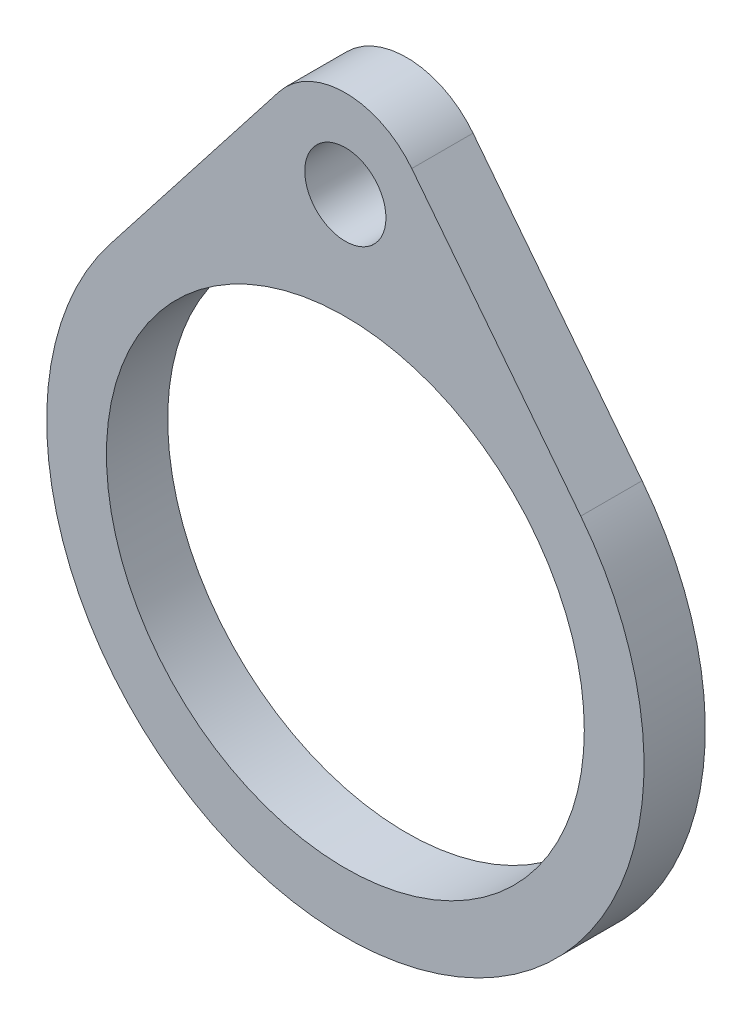
ISO-10303-21;
HEADER;
FILE_DESCRIPTION(('STEP AP214'),'2;1');
FILE_NAME('part.step','',(''),(''),'','','');
FILE_SCHEMA(('AUTOMOTIVE_DESIGN { 1 0 10303 214 1 1 1 1 }'));
ENDSEC;
DATA;
#1=APPLICATION_CONTEXT('core data for automotive mechanical design processes');
#2=APPLICATION_PROTOCOL_DEFINITION('international standard','automotive_design',2000,#1);
#3=PRODUCT_CONTEXT('',#1,'mechanical');
#4=PRODUCT('Part','Part','',(#3));
#5=PRODUCT_RELATED_PRODUCT_CATEGORY('part','',(#4));
#6=PRODUCT_DEFINITION_FORMATION('','',#4);
#7=PRODUCT_DEFINITION_CONTEXT('part definition',#1,'design');
#8=PRODUCT_DEFINITION('design','',#6,#7);
#9=PRODUCT_DEFINITION_SHAPE('','',#8);
#10=(LENGTH_UNIT() NAMED_UNIT(*) SI_UNIT(.MILLI.,.METRE.));
#11=(NAMED_UNIT(*) PLANE_ANGLE_UNIT() SI_UNIT($,.RADIAN.));
#12=(NAMED_UNIT(*) SI_UNIT($,.STERADIAN.) SOLID_ANGLE_UNIT());
#13=UNCERTAINTY_MEASURE_WITH_UNIT(LENGTH_MEASURE(1.E-05),#10,'distance_accuracy_value','');
#14=(GEOMETRIC_REPRESENTATION_CONTEXT(3) GLOBAL_UNCERTAINTY_ASSIGNED_CONTEXT((#13)) GLOBAL_UNIT_ASSIGNED_CONTEXT((#10,
#11,#12)) REPRESENTATION_CONTEXT('',''));
#15=CARTESIAN_POINT('',(0.,0.,0.));
#16=DIRECTION('',(0.,0.,1.));
#17=DIRECTION('',(1.,0.,0.));
#18=AXIS2_PLACEMENT_3D('',#15,#16,#17);
#19=CARTESIAN_POINT('',(0.,0.,4.));
#20=DIRECTION('',(0.,0.,1.));
#21=DIRECTION('',(1.,0.,0.));
#22=AXIS2_PLACEMENT_3D('',#19,#20,#21);
#23=PLANE('',#22);
#24=CARTESIAN_POINT('',(0.,0.,4.));
#25=DIRECTION('',(0.,0.,1.));
#26=DIRECTION('',(1.,0.,0.));
#27=AXIS2_PLACEMENT_3D('',#24,#25,#26);
#28=CIRCLE('',#27,19.5);
#29=CARTESIAN_POINT('',(-15.3704261489394,12.,4.));
#30=VERTEX_POINT('',#29);
#31=CARTESIAN_POINT('',(15.3704261489394,12.,4.));
#32=VERTEX_POINT('',#31);
#33=EDGE_CURVE('E11',#30,#32,#28,.T.);
#34=ORIENTED_EDGE('',*,*,#33,.T.);
#35=DIRECTION('',(-0.615384615384615,0.788226981996893,0.));
#36=VECTOR('',#35,1.);
#37=CARTESIAN_POINT('',(15.3704261489394,12.,4.));
#38=LINE('',#37,#36);
#39=CARTESIAN_POINT('',(4.33524840098291,26.1346153846154,4.));
#40=VERTEX_POINT('',#39);
#41=EDGE_CURVE('E95',#32,#40,#38,.T.);
#42=ORIENTED_EDGE('',*,*,#41,.T.);
#43=CARTESIAN_POINT('',(0.,22.75,4.));
#44=DIRECTION('',(0.,0.,1.));
#45=DIRECTION('',(1.,0.,0.));
#46=AXIS2_PLACEMENT_3D('',#43,#44,#45);
#47=CIRCLE('',#46,5.5);
#48=CARTESIAN_POINT('',(-4.33524840098291,26.1346153846154,4.));
#49=VERTEX_POINT('',#48);
#50=EDGE_CURVE('E83',#40,#49,#47,.T.);
#51=ORIENTED_EDGE('',*,*,#50,.T.);
#52=DIRECTION('',(0.615384615384615,0.788226981996893,0.));
#53=VECTOR('',#52,1.);
#54=CARTESIAN_POINT('',(-15.3704261489394,12.,4.));
#55=LINE('',#54,#53);
#56=EDGE_CURVE('E102',#30,#49,#55,.T.);
#57=ORIENTED_EDGE('',*,*,#56,.F.);
#58=EDGE_LOOP('',(#34,#42,#51,#57));
#59=FACE_BOUND('',#58,.T.);
#60=CARTESIAN_POINT('',(0.,0.,4.));
#61=DIRECTION('',(0.,0.,1.));
#62=DIRECTION('',(1.,0.,0.));
#63=AXIS2_PLACEMENT_3D('',#60,#61,#62);
#64=CIRCLE('',#63,15.6);
#65=CARTESIAN_POINT('',(15.6,0.,4.));
#66=VERTEX_POINT('',#65);
#67=EDGE_CURVE('E119',#66,#66,#64,.T.);
#68=ORIENTED_EDGE('',*,*,#67,.F.);
#69=EDGE_LOOP('',(#68));
#70=FACE_BOUND('',#69,.T.);
#71=CARTESIAN_POINT('',(0.,22.5,4.));
#72=DIRECTION('',(0.,0.,1.));
#73=DIRECTION('',(1.,0.,0.));
#74=AXIS2_PLACEMENT_3D('',#71,#72,#73);
#75=CIRCLE('',#74,2.65);
#76=CARTESIAN_POINT('',(2.65,22.5,4.));
#77=VERTEX_POINT('',#76);
#78=EDGE_CURVE('E164',#77,#77,#75,.T.);
#79=ORIENTED_EDGE('',*,*,#78,.F.);
#80=EDGE_LOOP('',(#79));
#81=FACE_BOUND('',#80,.T.);
#82=ADVANCED_FACE('F45',(#59,#70,#81),#23,.T.);
#83=CARTESIAN_POINT('',(0.,0.,0.));
#84=DIRECTION('',(0.,0.,1.));
#85=DIRECTION('',(1.,0.,0.));
#86=AXIS2_PLACEMENT_3D('',#83,#84,#85);
#87=PLANE('',#86);
#88=CARTESIAN_POINT('',(0.,0.,0.));
#89=DIRECTION('',(0.,0.,1.));
#90=DIRECTION('',(1.,0.,0.));
#91=AXIS2_PLACEMENT_3D('',#88,#89,#90);
#92=CIRCLE('',#91,19.5);
#93=CARTESIAN_POINT('',(-15.3704261489394,12.,0.));
#94=VERTEX_POINT('',#93);
#95=CARTESIAN_POINT('',(15.3704261489394,12.,0.));
#96=VERTEX_POINT('',#95);
#97=EDGE_CURVE('E49',#94,#96,#92,.T.);
#98=ORIENTED_EDGE('',*,*,#97,.F.);
#99=DIRECTION('',(0.615384615384615,0.788226981996893,0.));
#100=VECTOR('',#99,1.);
#101=CARTESIAN_POINT('',(-15.3704261489394,12.,0.));
#102=LINE('',#101,#100);
#103=CARTESIAN_POINT('',(-4.33524840098291,26.1346153846154,0.));
#104=VERTEX_POINT('',#103);
#105=EDGE_CURVE('E152',#94,#104,#102,.T.);
#106=ORIENTED_EDGE('',*,*,#105,.T.);
#107=CARTESIAN_POINT('',(0.,22.75,0.));
#108=DIRECTION('',(0.,0.,1.));
#109=DIRECTION('',(1.,0.,0.));
#110=AXIS2_PLACEMENT_3D('',#107,#108,#109);
#111=CIRCLE('',#110,5.5);
#112=CARTESIAN_POINT('',(4.33524840098291,26.1346153846154,0.));
#113=VERTEX_POINT('',#112);
#114=EDGE_CURVE('E159',#113,#104,#111,.T.);
#115=ORIENTED_EDGE('',*,*,#114,.F.);
#116=DIRECTION('',(-0.615384615384615,0.788226981996893,0.));
#117=VECTOR('',#116,1.);
#118=CARTESIAN_POINT('',(15.3704261489394,12.,0.));
#119=LINE('',#118,#117);
#120=EDGE_CURVE('E105',#96,#113,#119,.T.);
#121=ORIENTED_EDGE('',*,*,#120,.F.);
#122=EDGE_LOOP('',(#98,#106,#115,#121));
#123=FACE_BOUND('',#122,.T.);
#124=CARTESIAN_POINT('',(0.,0.,0.));
#125=DIRECTION('',(0.,0.,1.));
#126=DIRECTION('',(1.,0.,0.));
#127=AXIS2_PLACEMENT_3D('',#124,#125,#126);
#128=CIRCLE('',#127,15.6);
#129=CARTESIAN_POINT('',(15.6,0.,0.));
#130=VERTEX_POINT('',#129);
#131=EDGE_CURVE('E118',#130,#130,#128,.T.);
#132=ORIENTED_EDGE('',*,*,#131,.T.);
#133=EDGE_LOOP('',(#132));
#134=FACE_BOUND('',#133,.T.);
#135=CARTESIAN_POINT('',(0.,22.5,0.));
#136=DIRECTION('',(0.,0.,1.));
#137=DIRECTION('',(1.,0.,0.));
#138=AXIS2_PLACEMENT_3D('',#135,#136,#137);
#139=CIRCLE('',#138,2.65);
#140=CARTESIAN_POINT('',(2.65,22.5,0.));
#141=VERTEX_POINT('',#140);
#142=EDGE_CURVE('E155',#141,#141,#139,.T.);
#143=ORIENTED_EDGE('',*,*,#142,.T.);
#144=EDGE_LOOP('',(#143));
#145=FACE_BOUND('',#144,.T.);
#146=ADVANCED_FACE('F127',(#123,#134,#145),#87,.F.);
#147=CARTESIAN_POINT('',(0.,0.,4.));
#148=DIRECTION('',(0.,0.,-1.));
#149=DIRECTION('',(-1.,0.,0.));
#150=AXIS2_PLACEMENT_3D('',#147,#148,#149);
#151=CYLINDRICAL_SURFACE('',#150,19.5);
#152=ORIENTED_EDGE('',*,*,#33,.F.);
#153=DIRECTION('',(0.,0.,-1.));
#154=VECTOR('',#153,1.);
#155=CARTESIAN_POINT('',(-15.3704261489394,12.,4.));
#156=LINE('',#155,#154);
#157=EDGE_CURVE('E111',#30,#94,#156,.T.);
#158=ORIENTED_EDGE('',*,*,#157,.T.);
#159=ORIENTED_EDGE('',*,*,#97,.T.);
#160=DIRECTION('',(0.,0.,-1.));
#161=VECTOR('',#160,1.);
#162=CARTESIAN_POINT('',(15.3704261489394,12.,4.));
#163=LINE('',#162,#161);
#164=EDGE_CURVE('E107',#32,#96,#163,.T.);
#165=ORIENTED_EDGE('',*,*,#164,.F.);
#166=EDGE_LOOP('',(#152,#158,#159,#165));
#167=FACE_BOUND('',#166,.T.);
#168=ADVANCED_FACE('F47',(#167),#151,.T.);
#169=CARTESIAN_POINT('',(0.,0.,4.));
#170=DIRECTION('',(0.,0.,-1.));
#171=DIRECTION('',(-1.,0.,0.));
#172=AXIS2_PLACEMENT_3D('',#169,#170,#171);
#173=CYLINDRICAL_SURFACE('',#172,15.6);
#174=ORIENTED_EDGE('',*,*,#67,.T.);
#175=EDGE_LOOP('',(#174));
#176=FACE_BOUND('',#175,.T.);
#177=ORIENTED_EDGE('',*,*,#131,.F.);
#178=EDGE_LOOP('',(#177));
#179=FACE_BOUND('',#178,.T.);
#180=ADVANCED_FACE('F130',(#176,#179),#173,.F.);
#181=CARTESIAN_POINT('',(-15.3704261489394,12.,4.));
#182=DIRECTION('',(-0.788226981996893,0.615384615384615,0.));
#183=DIRECTION('',(-0.615384615384615,-0.788226981996893,0.));
#184=AXIS2_PLACEMENT_3D('',#181,#182,#183);
#185=PLANE('',#184);
#186=ORIENTED_EDGE('',*,*,#105,.F.);
#187=ORIENTED_EDGE('',*,*,#157,.F.);
#188=ORIENTED_EDGE('',*,*,#56,.T.);
#189=DIRECTION('',(0.,0.,-1.));
#190=VECTOR('',#189,1.);
#191=CARTESIAN_POINT('',(-4.33524840098291,26.1346153846154,4.));
#192=LINE('',#191,#190);
#193=EDGE_CURVE('E90',#49,#104,#192,.T.);
#194=ORIENTED_EDGE('',*,*,#193,.T.);
#195=EDGE_LOOP('',(#186,#187,#188,#194));
#196=FACE_BOUND('',#195,.T.);
#197=ADVANCED_FACE('F132',(#196),#185,.T.);
#198=CARTESIAN_POINT('',(15.3704261489394,12.,4.));
#199=DIRECTION('',(-0.788226981996893,-0.615384615384615,0.));
#200=DIRECTION('',(0.615384615384615,-0.788226981996893,0.));
#201=AXIS2_PLACEMENT_3D('',#198,#199,#200);
#202=PLANE('',#201);
#203=ORIENTED_EDGE('',*,*,#120,.T.);
#204=DIRECTION('',(0.,0.,-1.));
#205=VECTOR('',#204,1.);
#206=CARTESIAN_POINT('',(4.33524840098291,26.1346153846154,4.));
#207=LINE('',#206,#205);
#208=EDGE_CURVE('E88',#40,#113,#207,.T.);
#209=ORIENTED_EDGE('',*,*,#208,.F.);
#210=ORIENTED_EDGE('',*,*,#41,.F.);
#211=ORIENTED_EDGE('',*,*,#164,.T.);
#212=EDGE_LOOP('',(#203,#209,#210,#211));
#213=FACE_BOUND('',#212,.T.);
#214=ADVANCED_FACE('F104',(#213),#202,.F.);
#215=CARTESIAN_POINT('',(0.,22.5,4.));
#216=DIRECTION('',(0.,0.,-1.));
#217=DIRECTION('',(-1.,0.,0.));
#218=AXIS2_PLACEMENT_3D('',#215,#216,#217);
#219=CYLINDRICAL_SURFACE('',#218,2.65);
#220=ORIENTED_EDGE('',*,*,#78,.T.);
#221=EDGE_LOOP('',(#220));
#222=FACE_BOUND('',#221,.T.);
#223=ORIENTED_EDGE('',*,*,#142,.F.);
#224=EDGE_LOOP('',(#223));
#225=FACE_BOUND('',#224,.T.);
#226=ADVANCED_FACE('F172',(#222,#225),#219,.F.);
#227=CARTESIAN_POINT('',(0.,22.75,4.));
#228=DIRECTION('',(0.,0.,-1.));
#229=DIRECTION('',(-1.,0.,0.));
#230=AXIS2_PLACEMENT_3D('',#227,#228,#229);
#231=CYLINDRICAL_SURFACE('',#230,5.5);
#232=ORIENTED_EDGE('',*,*,#114,.T.);
#233=ORIENTED_EDGE('',*,*,#193,.F.);
#234=ORIENTED_EDGE('',*,*,#50,.F.);
#235=ORIENTED_EDGE('',*,*,#208,.T.);
#236=EDGE_LOOP('',(#232,#233,#234,#235));
#237=FACE_BOUND('',#236,.T.);
#238=ADVANCED_FACE('F86',(#237),#231,.T.);
#239=CLOSED_SHELL('',(#82,#146,#168,#180,#197,#214,#226,#238));
#240=MANIFOLD_SOLID_BREP('B2',#239);
#241=ADVANCED_BREP_SHAPE_REPRESENTATION('',(#18,#240),#14);
#242=SHAPE_DEFINITION_REPRESENTATION(#9,#241);
ENDSEC;
END-ISO-10303-21;
